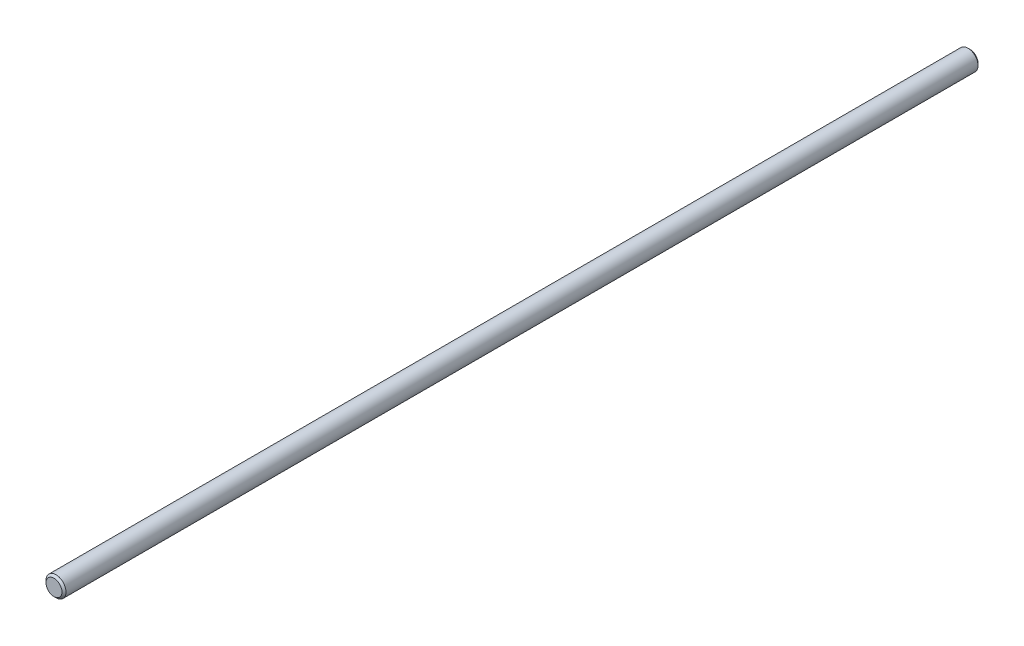
ISO-10303-21;
HEADER;
FILE_DESCRIPTION(('STEP AP214'),'2;1');
FILE_NAME('part.step','',(''),(''),'','','');
FILE_SCHEMA(('AUTOMOTIVE_DESIGN { 1 0 10303 214 1 1 1 1 }'));
ENDSEC;
DATA;
#1=APPLICATION_CONTEXT('core data for automotive mechanical design processes');
#2=APPLICATION_PROTOCOL_DEFINITION('international standard','automotive_design',2000,#1);
#3=PRODUCT_CONTEXT('',#1,'mechanical');
#4=PRODUCT('Part','Part','',(#3));
#5=PRODUCT_RELATED_PRODUCT_CATEGORY('part','',(#4));
#6=PRODUCT_DEFINITION_FORMATION('','',#4);
#7=PRODUCT_DEFINITION_CONTEXT('part definition',#1,'design');
#8=PRODUCT_DEFINITION('design','',#6,#7);
#9=PRODUCT_DEFINITION_SHAPE('','',#8);
#10=(LENGTH_UNIT() NAMED_UNIT(*) SI_UNIT(.MILLI.,.METRE.));
#11=(NAMED_UNIT(*) PLANE_ANGLE_UNIT() SI_UNIT($,.RADIAN.));
#12=(NAMED_UNIT(*) SI_UNIT($,.STERADIAN.) SOLID_ANGLE_UNIT());
#13=UNCERTAINTY_MEASURE_WITH_UNIT(LENGTH_MEASURE(1.E-05),#10,'distance_accuracy_value','');
#14=(GEOMETRIC_REPRESENTATION_CONTEXT(3) GLOBAL_UNCERTAINTY_ASSIGNED_CONTEXT((#13)) GLOBAL_UNIT_ASSIGNED_CONTEXT((#10,
#11,#12)) REPRESENTATION_CONTEXT('',''));
#15=CARTESIAN_POINT('',(0.,0.,0.));
#16=DIRECTION('',(0.,0.,1.));
#17=DIRECTION('',(1.,0.,0.));
#18=AXIS2_PLACEMENT_3D('',#15,#16,#17);
#19=CARTESIAN_POINT('',(0.,0.,275.));
#20=DIRECTION('',(0.,0.,-1.));
#21=DIRECTION('',(-1.,0.,0.));
#22=AXIS2_PLACEMENT_3D('',#19,#20,#21);
#23=CYLINDRICAL_SURFACE('',#22,6.);
#24=CARTESIAN_POINT('',(0.,0.,-273.8));
#25=DIRECTION('',(0.,0.,1.));
#26=DIRECTION('',(1.,0.,0.));
#27=AXIS2_PLACEMENT_3D('',#24,#25,#26);
#28=CIRCLE('',#27,6.);
#29=CARTESIAN_POINT('',(6.,0.,-273.8));
#30=VERTEX_POINT('',#29);
#31=EDGE_CURVE('E41',#30,#30,#28,.T.);
#32=ORIENTED_EDGE('',*,*,#31,.T.);
#33=EDGE_LOOP('',(#32));
#34=FACE_BOUND('',#33,.T.);
#35=CARTESIAN_POINT('',(0.,0.,273.8));
#36=DIRECTION('',(0.,0.,1.));
#37=DIRECTION('',(1.,0.,0.));
#38=AXIS2_PLACEMENT_3D('',#35,#36,#37);
#39=CIRCLE('',#38,6.);
#40=CARTESIAN_POINT('',(6.,0.,273.8));
#41=VERTEX_POINT('',#40);
#42=EDGE_CURVE('E45',#41,#41,#39,.F.);
#43=ORIENTED_EDGE('',*,*,#42,.T.);
#44=EDGE_LOOP('',(#43));
#45=FACE_BOUND('',#44,.T.);
#46=ADVANCED_FACE('F30',(#34,#45),#23,.T.);
#47=CARTESIAN_POINT('',(0.,0.,275.));
#48=DIRECTION('',(0.,0.,1.));
#49=DIRECTION('',(1.,0.,0.));
#50=AXIS2_PLACEMENT_3D('',#47,#48,#49);
#51=PLANE('',#50);
#52=CARTESIAN_POINT('',(0.,0.,275.));
#53=DIRECTION('',(0.,0.,1.));
#54=DIRECTION('',(1.,0.,0.));
#55=AXIS2_PLACEMENT_3D('',#52,#53,#54);
#56=CIRCLE('',#55,4.79999999999997);
#57=CARTESIAN_POINT('',(4.79999999999997,0.,275.));
#58=VERTEX_POINT('',#57);
#59=EDGE_CURVE('E10',#58,#58,#56,.T.);
#60=ORIENTED_EDGE('',*,*,#59,.T.);
#61=EDGE_LOOP('',(#60));
#62=FACE_BOUND('',#61,.T.);
#63=ADVANCED_FACE('F61',(#62),#51,.T.);
#64=CARTESIAN_POINT('',(0.,0.,-275.));
#65=DIRECTION('',(0.,0.,1.));
#66=DIRECTION('',(1.,0.,0.));
#67=AXIS2_PLACEMENT_3D('',#64,#65,#66);
#68=PLANE('',#67);
#69=CARTESIAN_POINT('',(0.,0.,-275.));
#70=DIRECTION('',(0.,0.,1.));
#71=DIRECTION('',(1.,0.,0.));
#72=AXIS2_PLACEMENT_3D('',#69,#70,#71);
#73=CIRCLE('',#72,4.80000000000003);
#74=CARTESIAN_POINT('',(4.80000000000003,0.,-275.));
#75=VERTEX_POINT('',#74);
#76=EDGE_CURVE('E37',#75,#75,#73,.F.);
#77=ORIENTED_EDGE('',*,*,#76,.T.);
#78=EDGE_LOOP('',(#77));
#79=FACE_BOUND('',#78,.T.);
#80=ADVANCED_FACE('F58',(#79),#68,.F.);
#81=CARTESIAN_POINT('',(0.,0.,-273.8));
#82=DIRECTION('',(0.,0.,1.));
#83=DIRECTION('',(1.,0.,0.));
#84=AXIS2_PLACEMENT_3D('',#81,#82,#83);
#85=CONICAL_SURFACE('',#84,6.,0.785398163397493);
#86=ORIENTED_EDGE('',*,*,#76,.F.);
#87=EDGE_LOOP('',(#86));
#88=FACE_BOUND('',#87,.T.);
#89=ORIENTED_EDGE('',*,*,#31,.F.);
#90=EDGE_LOOP('',(#89));
#91=FACE_BOUND('',#90,.T.);
#92=ADVANCED_FACE('F54',(#88,#91),#85,.T.);
#93=CARTESIAN_POINT('',(0.,0.,275.));
#94=DIRECTION('',(0.,0.,-1.));
#95=DIRECTION('',(-1.,0.,0.));
#96=AXIS2_PLACEMENT_3D('',#93,#94,#95);
#97=CONICAL_SURFACE('',#96,4.79999999999997,0.78539816339747);
#98=ORIENTED_EDGE('',*,*,#42,.F.);
#99=EDGE_LOOP('',(#98));
#100=FACE_BOUND('',#99,.T.);
#101=ORIENTED_EDGE('',*,*,#59,.F.);
#102=EDGE_LOOP('',(#101));
#103=FACE_BOUND('',#102,.T.);
#104=ADVANCED_FACE('F32',(#100,#103),#97,.T.);
#105=CLOSED_SHELL('',(#46,#63,#80,#92,#104));
#106=MANIFOLD_SOLID_BREP('B2',#105);
#107=ADVANCED_BREP_SHAPE_REPRESENTATION('',(#18,#106),#14);
#108=SHAPE_DEFINITION_REPRESENTATION(#9,#107);
ENDSEC;
END-ISO-10303-21;
